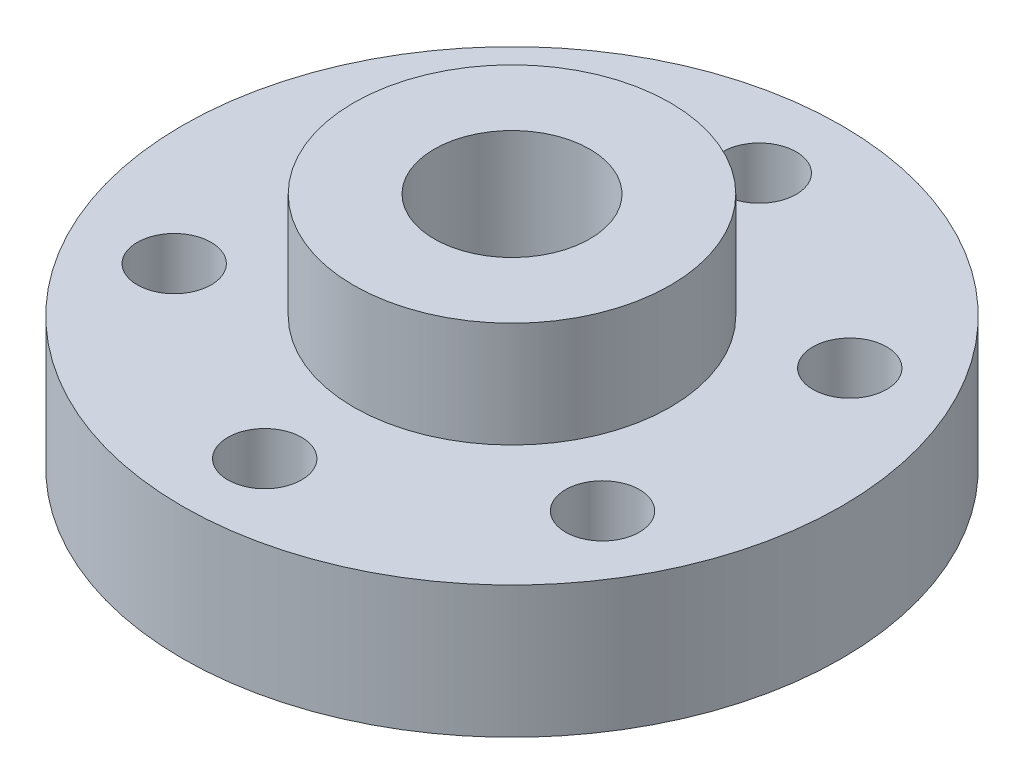
ISO-10303-21;
HEADER;
FILE_DESCRIPTION(('STEP AP214'),'2;1');
FILE_NAME('part.step','',(''),(''),'','','');
FILE_SCHEMA(('AUTOMOTIVE_DESIGN { 1 0 10303 214 1 1 1 1 }'));
ENDSEC;
DATA;
#1=APPLICATION_CONTEXT('core data for automotive mechanical design processes');
#2=APPLICATION_PROTOCOL_DEFINITION('international standard','automotive_design',2000,#1);
#3=PRODUCT_CONTEXT('',#1,'mechanical');
#4=PRODUCT('Part','Part','',(#3));
#5=PRODUCT_RELATED_PRODUCT_CATEGORY('part','',(#4));
#6=PRODUCT_DEFINITION_FORMATION('','',#4);
#7=PRODUCT_DEFINITION_CONTEXT('part definition',#1,'design');
#8=PRODUCT_DEFINITION('design','',#6,#7);
#9=PRODUCT_DEFINITION_SHAPE('','',#8);
#10=(LENGTH_UNIT() NAMED_UNIT(*) SI_UNIT(.MILLI.,.METRE.));
#11=(NAMED_UNIT(*) PLANE_ANGLE_UNIT() SI_UNIT($,.RADIAN.));
#12=(NAMED_UNIT(*) SI_UNIT($,.STERADIAN.) SOLID_ANGLE_UNIT());
#13=UNCERTAINTY_MEASURE_WITH_UNIT(LENGTH_MEASURE(1.E-05),#10,'distance_accuracy_value','');
#14=(GEOMETRIC_REPRESENTATION_CONTEXT(3) GLOBAL_UNCERTAINTY_ASSIGNED_CONTEXT((#13)) GLOBAL_UNIT_ASSIGNED_CONTEXT((#10,
#11,#12)) REPRESENTATION_CONTEXT('',''));
#15=CARTESIAN_POINT('',(0.,0.,0.));
#16=DIRECTION('',(0.,0.,1.));
#17=DIRECTION('',(1.,0.,0.));
#18=AXIS2_PLACEMENT_3D('',#15,#16,#17);
#19=CARTESIAN_POINT('',(0.,0.,0.));
#20=DIRECTION('',(0.,-1.,0.));
#21=DIRECTION('',(0.,0.,-1.));
#22=AXIS2_PLACEMENT_3D('',#19,#20,#21);
#23=CYLINDRICAL_SURFACE('',#22,12.7);
#24=CARTESIAN_POINT('',(0.,5.08,0.));
#25=DIRECTION('',(0.,-1.,0.));
#26=DIRECTION('',(0.,0.,-1.));
#27=AXIS2_PLACEMENT_3D('',#24,#25,#26);
#28=CIRCLE('',#27,12.7);
#29=CARTESIAN_POINT('',(0.,5.08,-12.7));
#30=VERTEX_POINT('',#29);
#31=EDGE_CURVE('E10',#30,#30,#28,.T.);
#32=ORIENTED_EDGE('',*,*,#31,.T.);
#33=EDGE_LOOP('',(#32));
#34=FACE_BOUND('',#33,.T.);
#35=CARTESIAN_POINT('',(0.,0.,0.));
#36=DIRECTION('',(0.,-1.,0.));
#37=DIRECTION('',(0.,0.,-1.));
#38=AXIS2_PLACEMENT_3D('',#35,#36,#37);
#39=CIRCLE('',#38,12.7);
#40=CARTESIAN_POINT('',(0.,0.,-12.7));
#41=VERTEX_POINT('',#40);
#42=EDGE_CURVE('E56',#41,#41,#39,.T.);
#43=ORIENTED_EDGE('',*,*,#42,.F.);
#44=EDGE_LOOP('',(#43));
#45=FACE_BOUND('',#44,.T.);
#46=ADVANCED_FACE('F34',(#34,#45),#23,.T.);
#47=CARTESIAN_POINT('',(12.7,5.08,0.));
#48=DIRECTION('',(0.,1.,0.));
#49=DIRECTION('',(0.,0.,1.));
#50=AXIS2_PLACEMENT_3D('',#47,#48,#49);
#51=PLANE('',#50);
#52=CARTESIAN_POINT('',(-8.24889197104672,5.08,-4.7625000000001));
#53=DIRECTION('',(0.,1.,0.));
#54=DIRECTION('',(0.,0.,1.));
#55=AXIS2_PLACEMENT_3D('',#52,#53,#54);
#56=CIRCLE('',#55,1.4224);
#57=CARTESIAN_POINT('',(-8.24889197104672,5.08,-3.3401000000001));
#58=VERTEX_POINT('',#57);
#59=EDGE_CURVE('E65',#58,#58,#56,.F.);
#60=ORIENTED_EDGE('',*,*,#59,.T.);
#61=EDGE_LOOP('',(#60));
#62=FACE_BOUND('',#61,.T.);
#63=CARTESIAN_POINT('',(-8.24889197104682,5.08,4.76249999999992));
#64=DIRECTION('',(0.,1.,0.));
#65=DIRECTION('',(0.,0.,1.));
#66=AXIS2_PLACEMENT_3D('',#63,#64,#65);
#67=CIRCLE('',#66,1.4224);
#68=CARTESIAN_POINT('',(-8.24889197104682,5.08,6.18489999999992));
#69=VERTEX_POINT('',#68);
#70=EDGE_CURVE('E68',#69,#69,#67,.F.);
#71=ORIENTED_EDGE('',*,*,#70,.T.);
#72=EDGE_LOOP('',(#71));
#73=FACE_BOUND('',#72,.T.);
#74=CARTESIAN_POINT('',(0.,5.08,9.525));
#75=DIRECTION('',(0.,1.,0.));
#76=DIRECTION('',(0.,0.,1.));
#77=AXIS2_PLACEMENT_3D('',#74,#75,#76);
#78=CIRCLE('',#77,1.4224);
#79=CARTESIAN_POINT('',(0.,5.08,10.9474));
#80=VERTEX_POINT('',#79);
#81=EDGE_CURVE('E71',#80,#80,#78,.F.);
#82=ORIENTED_EDGE('',*,*,#81,.T.);
#83=EDGE_LOOP('',(#82));
#84=FACE_BOUND('',#83,.T.);
#85=CARTESIAN_POINT('',(8.24889197104676,5.08,4.76250000000004));
#86=DIRECTION('',(0.,1.,0.));
#87=DIRECTION('',(0.,0.,1.));
#88=AXIS2_PLACEMENT_3D('',#85,#86,#87);
#89=CIRCLE('',#88,1.4224);
#90=CARTESIAN_POINT('',(8.24889197104676,5.08,6.18490000000004));
#91=VERTEX_POINT('',#90);
#92=EDGE_CURVE('E74',#91,#91,#89,.F.);
#93=ORIENTED_EDGE('',*,*,#92,.T.);
#94=EDGE_LOOP('',(#93));
#95=FACE_BOUND('',#94,.T.);
#96=CARTESIAN_POINT('',(8.24889197104679,5.08,-4.76249999999998));
#97=DIRECTION('',(0.,1.,0.));
#98=DIRECTION('',(0.,0.,1.));
#99=AXIS2_PLACEMENT_3D('',#96,#97,#98);
#100=CIRCLE('',#99,1.4224);
#101=CARTESIAN_POINT('',(8.24889197104679,5.08,-3.34009999999998));
#102=VERTEX_POINT('',#101);
#103=EDGE_CURVE('E77',#102,#102,#100,.F.);
#104=ORIENTED_EDGE('',*,*,#103,.T.);
#105=EDGE_LOOP('',(#104));
#106=FACE_BOUND('',#105,.T.);
#107=CARTESIAN_POINT('',(0.,5.08,-9.525));
#108=DIRECTION('',(0.,1.,0.));
#109=DIRECTION('',(0.,0.,1.));
#110=AXIS2_PLACEMENT_3D('',#107,#108,#109);
#111=CIRCLE('',#110,1.4224);
#112=CARTESIAN_POINT('',(0.,5.08,-8.1026));
#113=VERTEX_POINT('',#112);
#114=EDGE_CURVE('E59',#113,#113,#111,.F.);
#115=ORIENTED_EDGE('',*,*,#114,.T.);
#116=EDGE_LOOP('',(#115));
#117=FACE_BOUND('',#116,.T.);
#118=CARTESIAN_POINT('',(0.,5.08,0.));
#119=DIRECTION('',(0.,-1.,0.));
#120=DIRECTION('',(0.,0.,-1.));
#121=AXIS2_PLACEMENT_3D('',#118,#119,#120);
#122=CIRCLE('',#121,6.096);
#123=CARTESIAN_POINT('',(0.,5.08,-6.096));
#124=VERTEX_POINT('',#123);
#125=EDGE_CURVE('E40',#124,#124,#122,.T.);
#126=ORIENTED_EDGE('',*,*,#125,.T.);
#127=EDGE_LOOP('',(#126));
#128=FACE_BOUND('',#127,.T.);
#129=ORIENTED_EDGE('',*,*,#31,.F.);
#130=EDGE_LOOP('',(#129));
#131=FACE_BOUND('',#130,.T.);
#132=ADVANCED_FACE('F117',(#62,#73,#84,#95,#106,#117,#128,#131),#51,.T.);
#133=CARTESIAN_POINT('',(0.,0.,0.));
#134=DIRECTION('',(0.,-1.,0.));
#135=DIRECTION('',(0.,0.,-1.));
#136=AXIS2_PLACEMENT_3D('',#133,#134,#135);
#137=CYLINDRICAL_SURFACE('',#136,6.096);
#138=CARTESIAN_POINT('',(0.,9.144,0.));
#139=DIRECTION('',(0.,-1.,0.));
#140=DIRECTION('',(0.,0.,-1.));
#141=AXIS2_PLACEMENT_3D('',#138,#139,#140);
#142=CIRCLE('',#141,6.096);
#143=CARTESIAN_POINT('',(0.,9.144,-6.096));
#144=VERTEX_POINT('',#143);
#145=EDGE_CURVE('E44',#144,#144,#142,.T.);
#146=ORIENTED_EDGE('',*,*,#145,.T.);
#147=EDGE_LOOP('',(#146));
#148=FACE_BOUND('',#147,.T.);
#149=ORIENTED_EDGE('',*,*,#125,.F.);
#150=EDGE_LOOP('',(#149));
#151=FACE_BOUND('',#150,.T.);
#152=ADVANCED_FACE('F121',(#148,#151),#137,.T.);
#153=CARTESIAN_POINT('',(6.096,9.144,0.));
#154=DIRECTION('',(0.,1.,0.));
#155=DIRECTION('',(0.,0.,1.));
#156=AXIS2_PLACEMENT_3D('',#153,#154,#155);
#157=PLANE('',#156);
#158=CARTESIAN_POINT('',(0.,9.144,0.));
#159=DIRECTION('',(0.,-1.,0.));
#160=DIRECTION('',(0.,0.,-1.));
#161=AXIS2_PLACEMENT_3D('',#158,#159,#160);
#162=CIRCLE('',#161,2.9972);
#163=CARTESIAN_POINT('',(0.,9.144,-2.9972));
#164=VERTEX_POINT('',#163);
#165=EDGE_CURVE('E48',#164,#164,#162,.T.);
#166=ORIENTED_EDGE('',*,*,#165,.T.);
#167=EDGE_LOOP('',(#166));
#168=FACE_BOUND('',#167,.T.);
#169=ORIENTED_EDGE('',*,*,#145,.F.);
#170=EDGE_LOOP('',(#169));
#171=FACE_BOUND('',#170,.T.);
#172=ADVANCED_FACE('F135',(#168,#171),#157,.T.);
#173=CARTESIAN_POINT('',(0.,0.,0.));
#174=DIRECTION('',(0.,-1.,0.));
#175=DIRECTION('',(0.,0.,-1.));
#176=AXIS2_PLACEMENT_3D('',#173,#174,#175);
#177=CYLINDRICAL_SURFACE('',#176,2.9972);
#178=CARTESIAN_POINT('',(0.,0.,0.));
#179=DIRECTION('',(0.,-1.,0.));
#180=DIRECTION('',(0.,0.,-1.));
#181=AXIS2_PLACEMENT_3D('',#178,#179,#180);
#182=CIRCLE('',#181,2.9972);
#183=CARTESIAN_POINT('',(0.,0.,-2.9972));
#184=VERTEX_POINT('',#183);
#185=EDGE_CURVE('E53',#184,#184,#182,.T.);
#186=ORIENTED_EDGE('',*,*,#185,.T.);
#187=EDGE_LOOP('',(#186));
#188=FACE_BOUND('',#187,.T.);
#189=ORIENTED_EDGE('',*,*,#165,.F.);
#190=EDGE_LOOP('',(#189));
#191=FACE_BOUND('',#190,.T.);
#192=ADVANCED_FACE('F128',(#188,#191),#177,.F.);
#193=CARTESIAN_POINT('',(2.9972,0.,0.));
#194=DIRECTION('',(0.,-1.,0.));
#195=DIRECTION('',(0.,0.,-1.));
#196=AXIS2_PLACEMENT_3D('',#193,#194,#195);
#197=PLANE('',#196);
#198=CARTESIAN_POINT('',(-8.24889197104672,0.,-4.7625000000001));
#199=DIRECTION('',(0.,1.,0.));
#200=DIRECTION('',(0.866025403784433,0.,0.50000000000001));
#201=AXIS2_PLACEMENT_3D('',#198,#199,#200);
#202=CIRCLE('',#201,1.4224);
#203=CARTESIAN_POINT('',(-7.01705743670375,0.,-4.05130000000008));
#204=VERTEX_POINT('',#203);
#205=EDGE_CURVE('E84',#204,#204,#202,.T.);
#206=ORIENTED_EDGE('',*,*,#205,.T.);
#207=EDGE_LOOP('',(#206));
#208=FACE_BOUND('',#207,.T.);
#209=CARTESIAN_POINT('',(-8.24889197104682,0.,4.76249999999992));
#210=DIRECTION('',(0.,1.,0.));
#211=DIRECTION('',(0.866025403784443,0.,-0.499999999999992));
#212=AXIS2_PLACEMENT_3D('',#209,#210,#211);
#213=CIRCLE('',#212,1.4224);
#214=CARTESIAN_POINT('',(-7.01705743670383,0.,4.05129999999994));
#215=VERTEX_POINT('',#214);
#216=EDGE_CURVE('E87',#215,#215,#213,.T.);
#217=ORIENTED_EDGE('',*,*,#216,.T.);
#218=EDGE_LOOP('',(#217));
#219=FACE_BOUND('',#218,.T.);
#220=CARTESIAN_POINT('',(0.,0.,9.525));
#221=DIRECTION('',(0.,1.,0.));
#222=DIRECTION('',(0.,0.,-1.));
#223=AXIS2_PLACEMENT_3D('',#220,#221,#222);
#224=CIRCLE('',#223,1.4224);
#225=CARTESIAN_POINT('',(0.,0.,8.1026));
#226=VERTEX_POINT('',#225);
#227=EDGE_CURVE('E90',#226,#226,#224,.T.);
#228=ORIENTED_EDGE('',*,*,#227,.T.);
#229=EDGE_LOOP('',(#228));
#230=FACE_BOUND('',#229,.T.);
#231=CARTESIAN_POINT('',(8.24889197104676,0.,4.76250000000004));
#232=DIRECTION('',(0.,1.,0.));
#233=DIRECTION('',(-0.866025403784436,0.,-0.500000000000004));
#234=AXIS2_PLACEMENT_3D('',#231,#232,#233);
#235=CIRCLE('',#234,1.4224);
#236=CARTESIAN_POINT('',(7.01705743670378,0.,4.05130000000003));
#237=VERTEX_POINT('',#236);
#238=EDGE_CURVE('E83',#237,#237,#235,.T.);
#239=ORIENTED_EDGE('',*,*,#238,.T.);
#240=EDGE_LOOP('',(#239));
#241=FACE_BOUND('',#240,.T.);
#242=CARTESIAN_POINT('',(8.24889197104679,0.,-4.76249999999998));
#243=DIRECTION('',(0.,1.,0.));
#244=DIRECTION('',(-0.86602540378444,0.,0.499999999999998));
#245=AXIS2_PLACEMENT_3D('',#242,#243,#244);
#246=CIRCLE('',#245,1.4224);
#247=CARTESIAN_POINT('',(7.0170574367038,0.,-4.05129999999998));
#248=VERTEX_POINT('',#247);
#249=EDGE_CURVE('E80',#248,#248,#246,.T.);
#250=ORIENTED_EDGE('',*,*,#249,.T.);
#251=EDGE_LOOP('',(#250));
#252=FACE_BOUND('',#251,.T.);
#253=CARTESIAN_POINT('',(0.,0.,-9.525));
#254=DIRECTION('',(0.,1.,0.));
#255=DIRECTION('',(0.,0.,1.));
#256=AXIS2_PLACEMENT_3D('',#253,#254,#255);
#257=CIRCLE('',#256,1.4224);
#258=CARTESIAN_POINT('',(0.,0.,-8.1026));
#259=VERTEX_POINT('',#258);
#260=EDGE_CURVE('E62',#259,#259,#257,.T.);
#261=ORIENTED_EDGE('',*,*,#260,.T.);
#262=EDGE_LOOP('',(#261));
#263=FACE_BOUND('',#262,.T.);
#264=ORIENTED_EDGE('',*,*,#42,.T.);
#265=EDGE_LOOP('',(#264));
#266=FACE_BOUND('',#265,.T.);
#267=ORIENTED_EDGE('',*,*,#185,.F.);
#268=EDGE_LOOP('',(#267));
#269=FACE_BOUND('',#268,.T.);
#270=ADVANCED_FACE('F96',(#208,#219,#230,#241,#252,#263,#266,#269),#197,.T.);
#271=CARTESIAN_POINT('',(0.,9.144,-9.525));
#272=DIRECTION('',(0.,-1.,0.));
#273=DIRECTION('',(0.,0.,-1.));
#274=AXIS2_PLACEMENT_3D('',#271,#272,#273);
#275=CYLINDRICAL_SURFACE('',#274,1.4224);
#276=ORIENTED_EDGE('',*,*,#114,.F.);
#277=EDGE_LOOP('',(#276));
#278=FACE_BOUND('',#277,.T.);
#279=ORIENTED_EDGE('',*,*,#260,.F.);
#280=EDGE_LOOP('',(#279));
#281=FACE_BOUND('',#280,.T.);
#282=ADVANCED_FACE('F112',(#278,#281),#275,.F.);
#283=CARTESIAN_POINT('',(8.24889197104679,9.144,-4.76249999999998));
#284=DIRECTION('',(0.,-1.,0.));
#285=DIRECTION('',(0.,0.,-1.));
#286=AXIS2_PLACEMENT_3D('',#283,#284,#285);
#287=CYLINDRICAL_SURFACE('',#286,1.4224);
#288=ORIENTED_EDGE('',*,*,#103,.F.);
#289=EDGE_LOOP('',(#288));
#290=FACE_BOUND('',#289,.T.);
#291=ORIENTED_EDGE('',*,*,#249,.F.);
#292=EDGE_LOOP('',(#291));
#293=FACE_BOUND('',#292,.T.);
#294=ADVANCED_FACE('F102',(#290,#293),#287,.F.);
#295=CARTESIAN_POINT('',(8.24889197104676,9.144,4.76250000000004));
#296=DIRECTION('',(0.,-1.,0.));
#297=DIRECTION('',(0.,0.,-1.));
#298=AXIS2_PLACEMENT_3D('',#295,#296,#297);
#299=CYLINDRICAL_SURFACE('',#298,1.4224);
#300=ORIENTED_EDGE('',*,*,#92,.F.);
#301=EDGE_LOOP('',(#300));
#302=FACE_BOUND('',#301,.T.);
#303=ORIENTED_EDGE('',*,*,#238,.F.);
#304=EDGE_LOOP('',(#303));
#305=FACE_BOUND('',#304,.T.);
#306=ADVANCED_FACE('F99',(#302,#305),#299,.F.);
#307=CARTESIAN_POINT('',(0.,9.144,9.525));
#308=DIRECTION('',(0.,-1.,0.));
#309=DIRECTION('',(0.,0.,-1.));
#310=AXIS2_PLACEMENT_3D('',#307,#308,#309);
#311=CYLINDRICAL_SURFACE('',#310,1.4224);
#312=ORIENTED_EDGE('',*,*,#81,.F.);
#313=EDGE_LOOP('',(#312));
#314=FACE_BOUND('',#313,.T.);
#315=ORIENTED_EDGE('',*,*,#227,.F.);
#316=EDGE_LOOP('',(#315));
#317=FACE_BOUND('',#316,.T.);
#318=ADVANCED_FACE('F101',(#314,#317),#311,.F.);
#319=CARTESIAN_POINT('',(-8.24889197104682,9.144,4.76249999999992));
#320=DIRECTION('',(0.,-1.,0.));
#321=DIRECTION('',(0.,0.,-1.));
#322=AXIS2_PLACEMENT_3D('',#319,#320,#321);
#323=CYLINDRICAL_SURFACE('',#322,1.4224);
#324=ORIENTED_EDGE('',*,*,#70,.F.);
#325=EDGE_LOOP('',(#324));
#326=FACE_BOUND('',#325,.T.);
#327=ORIENTED_EDGE('',*,*,#216,.F.);
#328=EDGE_LOOP('',(#327));
#329=FACE_BOUND('',#328,.T.);
#330=ADVANCED_FACE('F109',(#326,#329),#323,.F.);
#331=CARTESIAN_POINT('',(-8.24889197104672,9.144,-4.7625000000001));
#332=DIRECTION('',(0.,-1.,0.));
#333=DIRECTION('',(0.,0.,-1.));
#334=AXIS2_PLACEMENT_3D('',#331,#332,#333);
#335=CYLINDRICAL_SURFACE('',#334,1.4224);
#336=ORIENTED_EDGE('',*,*,#59,.F.);
#337=EDGE_LOOP('',(#336));
#338=FACE_BOUND('',#337,.T.);
#339=ORIENTED_EDGE('',*,*,#205,.F.);
#340=EDGE_LOOP('',(#339));
#341=FACE_BOUND('',#340,.T.);
#342=ADVANCED_FACE('F153',(#338,#341),#335,.F.);
#343=CLOSED_SHELL('',(#46,#132,#152,#172,#192,#270,#282,#294,#306,#318,#330,#342));
#344=MANIFOLD_SOLID_BREP('B2',#343);
#345=ADVANCED_BREP_SHAPE_REPRESENTATION('',(#18,#344),#14);
#346=SHAPE_DEFINITION_REPRESENTATION(#9,#345);
ENDSEC;
END-ISO-10303-21;
